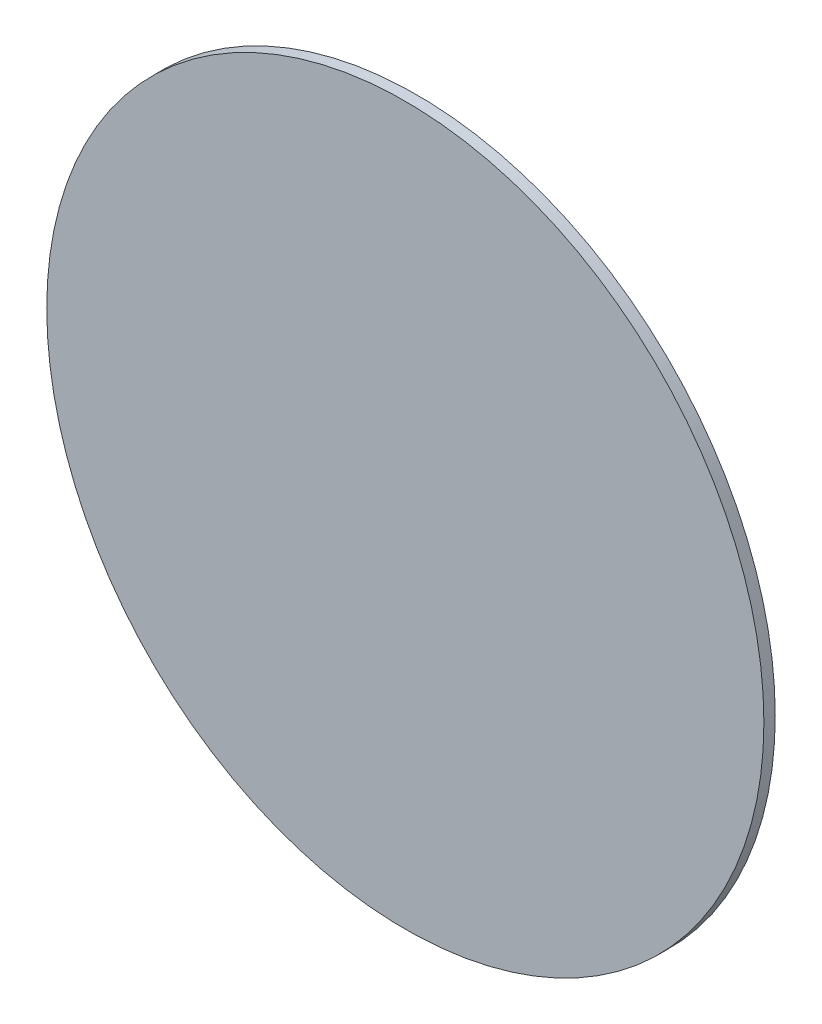
ISO-10303-21;
HEADER;
FILE_DESCRIPTION(('STEP AP214'),'2;1');
FILE_NAME('part.step','',(''),(''),'','','');
FILE_SCHEMA(('AUTOMOTIVE_DESIGN { 1 0 10303 214 1 1 1 1 }'));
ENDSEC;
DATA;
#1=APPLICATION_CONTEXT('core data for automotive mechanical design processes');
#2=APPLICATION_PROTOCOL_DEFINITION('international standard','automotive_design',2000,#1);
#3=PRODUCT_CONTEXT('',#1,'mechanical');
#4=PRODUCT('Part','Part','',(#3));
#5=PRODUCT_RELATED_PRODUCT_CATEGORY('part','',(#4));
#6=PRODUCT_DEFINITION_FORMATION('','',#4);
#7=PRODUCT_DEFINITION_CONTEXT('part definition',#1,'design');
#8=PRODUCT_DEFINITION('design','',#6,#7);
#9=PRODUCT_DEFINITION_SHAPE('','',#8);
#10=(LENGTH_UNIT() NAMED_UNIT(*) SI_UNIT(.MILLI.,.METRE.));
#11=(NAMED_UNIT(*) PLANE_ANGLE_UNIT() SI_UNIT($,.RADIAN.));
#12=(NAMED_UNIT(*) SI_UNIT($,.STERADIAN.) SOLID_ANGLE_UNIT());
#13=UNCERTAINTY_MEASURE_WITH_UNIT(LENGTH_MEASURE(1.E-05),#10,'distance_accuracy_value','');
#14=(GEOMETRIC_REPRESENTATION_CONTEXT(3) GLOBAL_UNCERTAINTY_ASSIGNED_CONTEXT((#13)) GLOBAL_UNIT_ASSIGNED_CONTEXT((#10,
#11,#12)) REPRESENTATION_CONTEXT('',''));
#15=CARTESIAN_POINT('',(0.,0.,0.));
#16=DIRECTION('',(0.,0.,1.));
#17=DIRECTION('',(1.,0.,0.));
#18=AXIS2_PLACEMENT_3D('',#15,#16,#17);
#19=CARTESIAN_POINT('',(0.,0.,5.));
#20=DIRECTION('',(0.,0.,-1.));
#21=DIRECTION('',(-1.,0.,0.));
#22=AXIS2_PLACEMENT_3D('',#19,#20,#21);
#23=CYLINDRICAL_SURFACE('',#22,158.);
#24=CARTESIAN_POINT('',(0.,0.,5.));
#25=DIRECTION('',(0.,0.,1.));
#26=DIRECTION('',(1.,0.,0.));
#27=AXIS2_PLACEMENT_3D('',#24,#25,#26);
#28=CIRCLE('',#27,158.);
#29=CARTESIAN_POINT('',(158.,0.,5.));
#30=VERTEX_POINT('',#29);
#31=EDGE_CURVE('E10',#30,#30,#28,.T.);
#32=ORIENTED_EDGE('',*,*,#31,.F.);
#33=EDGE_LOOP('',(#32));
#34=FACE_BOUND('',#33,.T.);
#35=CARTESIAN_POINT('',(0.,0.,0.));
#36=DIRECTION('',(0.,0.,1.));
#37=DIRECTION('',(1.,0.,0.));
#38=AXIS2_PLACEMENT_3D('',#35,#36,#37);
#39=CIRCLE('',#38,158.);
#40=CARTESIAN_POINT('',(158.,0.,0.));
#41=VERTEX_POINT('',#40);
#42=EDGE_CURVE('E45',#41,#41,#39,.T.);
#43=ORIENTED_EDGE('',*,*,#42,.T.);
#44=EDGE_LOOP('',(#43));
#45=FACE_BOUND('',#44,.T.);
#46=ADVANCED_FACE('F39',(#34,#45),#23,.T.);
#47=CARTESIAN_POINT('',(0.,0.,5.));
#48=DIRECTION('',(0.,0.,1.));
#49=DIRECTION('',(1.,0.,0.));
#50=AXIS2_PLACEMENT_3D('',#47,#48,#49);
#51=PLANE('',#50);
#52=ORIENTED_EDGE('',*,*,#31,.T.);
#53=EDGE_LOOP('',(#52));
#54=FACE_BOUND('',#53,.T.);
#55=ADVANCED_FACE('F53',(#54),#51,.T.);
#56=CARTESIAN_POINT('',(0.,0.,0.));
#57=DIRECTION('',(0.,0.,1.));
#58=DIRECTION('',(1.,0.,0.));
#59=AXIS2_PLACEMENT_3D('',#56,#57,#58);
#60=PLANE('',#59);
#61=ORIENTED_EDGE('',*,*,#42,.F.);
#62=EDGE_LOOP('',(#61));
#63=FACE_BOUND('',#62,.T.);
#64=ADVANCED_FACE('F55',(#63),#60,.F.);
#65=CLOSED_SHELL('',(#46,#55,#64));
#66=MANIFOLD_SOLID_BREP('B2',#65);
#67=ADVANCED_BREP_SHAPE_REPRESENTATION('',(#18,#66),#14);
#68=SHAPE_DEFINITION_REPRESENTATION(#9,#67);
ENDSEC;
END-ISO-10303-21;
